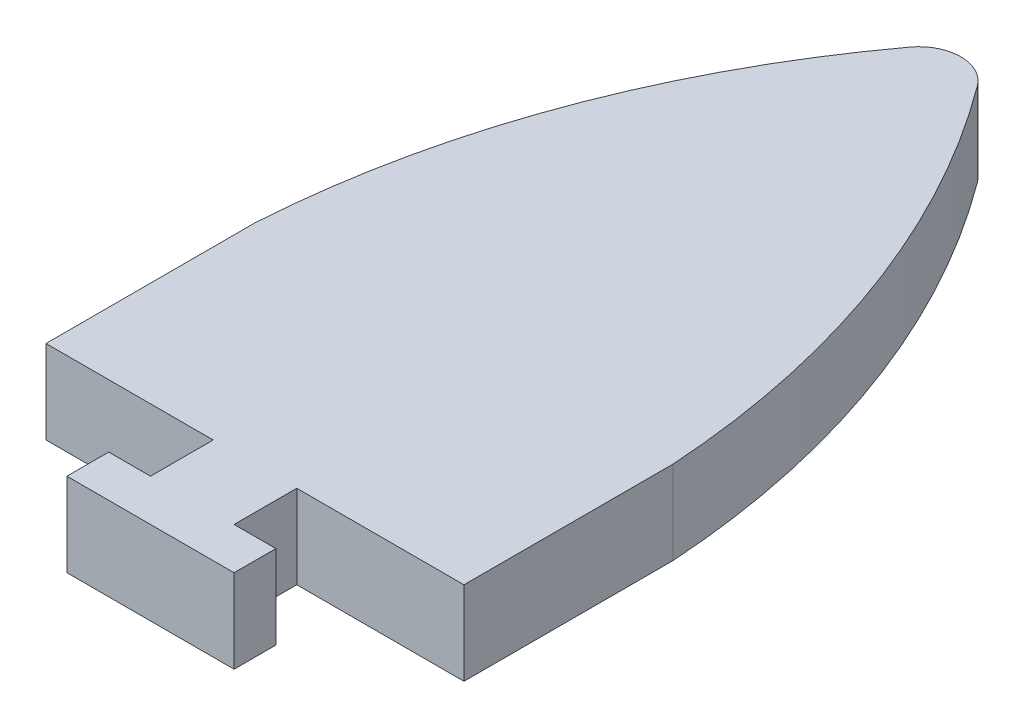
ISO-10303-21;
HEADER;
FILE_DESCRIPTION(('STEP AP214'),'2;1');
FILE_NAME('part.step','',(''),(''),'','','');
FILE_SCHEMA(('AUTOMOTIVE_DESIGN { 1 0 10303 214 1 1 1 1 }'));
ENDSEC;
DATA;
#1=APPLICATION_CONTEXT('core data for automotive mechanical design processes');
#2=APPLICATION_PROTOCOL_DEFINITION('international standard','automotive_design',2000,#1);
#3=PRODUCT_CONTEXT('',#1,'mechanical');
#4=PRODUCT('Part','Part','',(#3));
#5=PRODUCT_RELATED_PRODUCT_CATEGORY('part','',(#4));
#6=PRODUCT_DEFINITION_FORMATION('','',#4);
#7=PRODUCT_DEFINITION_CONTEXT('part definition',#1,'design');
#8=PRODUCT_DEFINITION('design','',#6,#7);
#9=PRODUCT_DEFINITION_SHAPE('','',#8);
#10=(LENGTH_UNIT() NAMED_UNIT(*) SI_UNIT(.MILLI.,.METRE.));
#11=(NAMED_UNIT(*) PLANE_ANGLE_UNIT() SI_UNIT($,.RADIAN.));
#12=(NAMED_UNIT(*) SI_UNIT($,.STERADIAN.) SOLID_ANGLE_UNIT());
#13=UNCERTAINTY_MEASURE_WITH_UNIT(LENGTH_MEASURE(1.E-05),#10,'distance_accuracy_value','');
#14=(GEOMETRIC_REPRESENTATION_CONTEXT(3) GLOBAL_UNCERTAINTY_ASSIGNED_CONTEXT((#13)) GLOBAL_UNIT_ASSIGNED_CONTEXT((#10,
#11,#12)) REPRESENTATION_CONTEXT('',''));
#15=CARTESIAN_POINT('',(0.,0.,0.));
#16=DIRECTION('',(0.,0.,1.));
#17=DIRECTION('',(1.,0.,0.));
#18=AXIS2_PLACEMENT_3D('',#15,#16,#17);
#19=CARTESIAN_POINT('',(0.,4.,-14.2696007662826));
#20=DIRECTION('',(0.,-1.,0.));
#21=DIRECTION('',(0.,0.,-1.));
#22=AXIS2_PLACEMENT_3D('',#19,#20,#21);
#23=CYLINDRICAL_SURFACE('',#22,2.);
#24=CARTESIAN_POINT('',(0.,0.,-14.2696007662826));
#25=DIRECTION('',(0.,1.,0.));
#26=DIRECTION('',(0.,0.,1.));
#27=AXIS2_PLACEMENT_3D('',#24,#25,#26);
#28=CIRCLE('',#27,2.);
#29=CARTESIAN_POINT('',(1.60752586199013,0.,-15.4595001750701));
#30=VERTEX_POINT('',#29);
#31=CARTESIAN_POINT('',(-1.60752586199013,0.,-15.4595001750701));
#32=VERTEX_POINT('',#31);
#33=EDGE_CURVE('E167',#30,#32,#28,.T.);
#34=ORIENTED_EDGE('',*,*,#33,.T.);
#35=DIRECTION('',(0.,-1.,0.));
#36=VECTOR('',#35,1.);
#37=CARTESIAN_POINT('',(-1.60752586199013,4.,-15.4595001750701));
#38=LINE('',#37,#36);
#39=CARTESIAN_POINT('',(-1.60752586199013,4.,-15.4595001750701));
#40=VERTEX_POINT('',#39);
#41=EDGE_CURVE('E11',#40,#32,#38,.T.);
#42=ORIENTED_EDGE('',*,*,#41,.F.);
#43=CARTESIAN_POINT('',(0.,4.,-14.2696007662826));
#44=DIRECTION('',(0.,1.,0.));
#45=DIRECTION('',(0.,0.,1.));
#46=AXIS2_PLACEMENT_3D('',#43,#44,#45);
#47=CIRCLE('',#46,2.);
#48=CARTESIAN_POINT('',(1.60752586199013,4.,-15.4595001750701));
#49=VERTEX_POINT('',#48);
#50=EDGE_CURVE('E193',#49,#40,#47,.T.);
#51=ORIENTED_EDGE('',*,*,#50,.F.);
#52=DIRECTION('',(0.,-1.,0.));
#53=VECTOR('',#52,1.);
#54=CARTESIAN_POINT('',(1.60752586199013,4.,-15.4595001750701));
#55=LINE('',#54,#53);
#56=EDGE_CURVE('E163',#49,#30,#55,.T.);
#57=ORIENTED_EDGE('',*,*,#56,.T.);
#58=EDGE_LOOP('',(#34,#42,#51,#57));
#59=FACE_BOUND('',#58,.T.);
#60=ADVANCED_FACE('F35',(#59),#23,.T.);
#61=CARTESIAN_POINT('',(33.1258675276527,4.,10.2503470110611));
#62=DIRECTION('',(0.,-1.,0.));
#63=DIRECTION('',(0.,0.,-1.));
#64=AXIS2_PLACEMENT_3D('',#61,#62,#63);
#65=CYLINDRICAL_SURFACE('',#64,43.2134800576615);
#66=CARTESIAN_POINT('',(33.1258675276527,0.,10.2503470110611));
#67=DIRECTION('',(0.,1.,0.));
#68=DIRECTION('',(0.,0.,1.));
#69=AXIS2_PLACEMENT_3D('',#66,#67,#68);
#70=CIRCLE('',#69,43.2134800576615);
#71=CARTESIAN_POINT('',(-10.,0.,7.50000000000001));
#72=VERTEX_POINT('',#71);
#73=EDGE_CURVE('E170',#32,#72,#70,.T.);
#74=ORIENTED_EDGE('',*,*,#73,.T.);
#75=DIRECTION('',(0.,-1.,0.));
#76=VECTOR('',#75,1.);
#77=CARTESIAN_POINT('',(-10.,4.,7.50000000000001));
#78=LINE('',#77,#76);
#79=CARTESIAN_POINT('',(-10.,4.,7.50000000000001));
#80=VERTEX_POINT('',#79);
#81=EDGE_CURVE('E43',#80,#72,#78,.T.);
#82=ORIENTED_EDGE('',*,*,#81,.F.);
#83=CARTESIAN_POINT('',(33.1258675276527,4.,10.2503470110611));
#84=DIRECTION('',(0.,1.,0.));
#85=DIRECTION('',(0.,0.,1.));
#86=AXIS2_PLACEMENT_3D('',#83,#84,#85);
#87=CIRCLE('',#86,43.2134800576615);
#88=EDGE_CURVE('E112',#40,#80,#87,.T.);
#89=ORIENTED_EDGE('',*,*,#88,.F.);
#90=ORIENTED_EDGE('',*,*,#41,.T.);
#91=EDGE_LOOP('',(#74,#82,#89,#90));
#92=FACE_BOUND('',#91,.T.);
#93=ADVANCED_FACE('F281',(#92),#65,.T.);
#94=CARTESIAN_POINT('',(-10.,4.,17.5));
#95=DIRECTION('',(1.,0.,0.));
#96=DIRECTION('',(0.,0.,-1.));
#97=AXIS2_PLACEMENT_3D('',#94,#95,#96);
#98=PLANE('',#97);
#99=DIRECTION('',(0.,0.,1.));
#100=VECTOR('',#99,1.);
#101=CARTESIAN_POINT('',(-10.,0.,17.5));
#102=LINE('',#101,#100);
#103=CARTESIAN_POINT('',(-10.,0.,17.5));
#104=VERTEX_POINT('',#103);
#105=EDGE_CURVE('E172',#72,#104,#102,.T.);
#106=ORIENTED_EDGE('',*,*,#105,.T.);
#107=DIRECTION('',(0.,-1.,0.));
#108=VECTOR('',#107,1.);
#109=CARTESIAN_POINT('',(-10.,4.,17.5));
#110=LINE('',#109,#108);
#111=CARTESIAN_POINT('',(-10.,4.,17.5));
#112=VERTEX_POINT('',#111);
#113=EDGE_CURVE('E218',#112,#104,#110,.T.);
#114=ORIENTED_EDGE('',*,*,#113,.F.);
#115=DIRECTION('',(0.,0.,1.));
#116=VECTOR('',#115,1.);
#117=CARTESIAN_POINT('',(-10.,4.,17.5));
#118=LINE('',#117,#116);
#119=EDGE_CURVE('E226',#80,#112,#118,.T.);
#120=ORIENTED_EDGE('',*,*,#119,.F.);
#121=ORIENTED_EDGE('',*,*,#81,.T.);
#122=EDGE_LOOP('',(#106,#114,#120,#121));
#123=FACE_BOUND('',#122,.T.);
#124=ADVANCED_FACE('F224',(#123),#98,.F.);
#125=CARTESIAN_POINT('',(-2.,4.,17.5));
#126=DIRECTION('',(0.,0.,-1.));
#127=DIRECTION('',(-1.,0.,0.));
#128=AXIS2_PLACEMENT_3D('',#125,#126,#127);
#129=PLANE('',#128);
#130=DIRECTION('',(1.,0.,0.));
#131=VECTOR('',#130,1.);
#132=CARTESIAN_POINT('',(-2.,0.,17.5));
#133=LINE('',#132,#131);
#134=CARTESIAN_POINT('',(-2.,0.,17.5));
#135=VERTEX_POINT('',#134);
#136=EDGE_CURVE('E174',#104,#135,#133,.T.);
#137=ORIENTED_EDGE('',*,*,#136,.T.);
#138=DIRECTION('',(0.,-1.,0.));
#139=VECTOR('',#138,1.);
#140=CARTESIAN_POINT('',(-2.,4.,17.5));
#141=LINE('',#140,#139);
#142=CARTESIAN_POINT('',(-2.,4.,17.5));
#143=VERTEX_POINT('',#142);
#144=EDGE_CURVE('E215',#143,#135,#141,.T.);
#145=ORIENTED_EDGE('',*,*,#144,.F.);
#146=DIRECTION('',(1.,0.,0.));
#147=VECTOR('',#146,1.);
#148=CARTESIAN_POINT('',(-2.,4.,17.5));
#149=LINE('',#148,#147);
#150=EDGE_CURVE('E244',#112,#143,#149,.T.);
#151=ORIENTED_EDGE('',*,*,#150,.F.);
#152=ORIENTED_EDGE('',*,*,#113,.T.);
#153=EDGE_LOOP('',(#137,#145,#151,#152));
#154=FACE_BOUND('',#153,.T.);
#155=ADVANCED_FACE('F235',(#154),#129,.F.);
#156=CARTESIAN_POINT('',(-2.,4.,20.5));
#157=DIRECTION('',(1.,0.,0.));
#158=DIRECTION('',(0.,0.,-1.));
#159=AXIS2_PLACEMENT_3D('',#156,#157,#158);
#160=PLANE('',#159);
#161=DIRECTION('',(0.,0.,1.));
#162=VECTOR('',#161,1.);
#163=CARTESIAN_POINT('',(-2.,0.,20.5));
#164=LINE('',#163,#162);
#165=CARTESIAN_POINT('',(-2.,0.,20.5));
#166=VERTEX_POINT('',#165);
#167=EDGE_CURVE('E176',#135,#166,#164,.T.);
#168=ORIENTED_EDGE('',*,*,#167,.T.);
#169=DIRECTION('',(0.,-1.,0.));
#170=VECTOR('',#169,1.);
#171=CARTESIAN_POINT('',(-2.,4.,20.5));
#172=LINE('',#171,#170);
#173=CARTESIAN_POINT('',(-2.,4.,20.5));
#174=VERTEX_POINT('',#173);
#175=EDGE_CURVE('E212',#174,#166,#172,.T.);
#176=ORIENTED_EDGE('',*,*,#175,.F.);
#177=DIRECTION('',(0.,0.,1.));
#178=VECTOR('',#177,1.);
#179=CARTESIAN_POINT('',(-2.,4.,20.5));
#180=LINE('',#179,#178);
#181=EDGE_CURVE('E241',#143,#174,#180,.T.);
#182=ORIENTED_EDGE('',*,*,#181,.F.);
#183=ORIENTED_EDGE('',*,*,#144,.T.);
#184=EDGE_LOOP('',(#168,#176,#182,#183));
#185=FACE_BOUND('',#184,.T.);
#186=ADVANCED_FACE('F239',(#185),#160,.F.);
#187=CARTESIAN_POINT('',(-4.,4.,20.5));
#188=DIRECTION('',(0.,0.,1.));
#189=DIRECTION('',(1.,0.,0.));
#190=AXIS2_PLACEMENT_3D('',#187,#188,#189);
#191=PLANE('',#190);
#192=DIRECTION('',(-1.,0.,0.));
#193=VECTOR('',#192,1.);
#194=CARTESIAN_POINT('',(-4.,0.,20.5));
#195=LINE('',#194,#193);
#196=CARTESIAN_POINT('',(-4.,0.,20.5));
#197=VERTEX_POINT('',#196);
#198=EDGE_CURVE('E178',#166,#197,#195,.T.);
#199=ORIENTED_EDGE('',*,*,#198,.T.);
#200=DIRECTION('',(0.,-1.,0.));
#201=VECTOR('',#200,1.);
#202=CARTESIAN_POINT('',(-4.,4.,20.5));
#203=LINE('',#202,#201);
#204=CARTESIAN_POINT('',(-4.,4.,20.5));
#205=VERTEX_POINT('',#204);
#206=EDGE_CURVE('E209',#205,#197,#203,.T.);
#207=ORIENTED_EDGE('',*,*,#206,.F.);
#208=DIRECTION('',(-1.,0.,0.));
#209=VECTOR('',#208,1.);
#210=CARTESIAN_POINT('',(-4.,4.,20.5));
#211=LINE('',#210,#209);
#212=EDGE_CURVE('E243',#174,#205,#211,.T.);
#213=ORIENTED_EDGE('',*,*,#212,.F.);
#214=ORIENTED_EDGE('',*,*,#175,.T.);
#215=EDGE_LOOP('',(#199,#207,#213,#214));
#216=FACE_BOUND('',#215,.T.);
#217=ADVANCED_FACE('F294',(#216),#191,.F.);
#218=CARTESIAN_POINT('',(-4.,4.,22.5));
#219=DIRECTION('',(1.,0.,0.));
#220=DIRECTION('',(0.,0.,-1.));
#221=AXIS2_PLACEMENT_3D('',#218,#219,#220);
#222=PLANE('',#221);
#223=DIRECTION('',(0.,0.,1.));
#224=VECTOR('',#223,1.);
#225=CARTESIAN_POINT('',(-4.,0.,22.5));
#226=LINE('',#225,#224);
#227=CARTESIAN_POINT('',(-4.,0.,22.5));
#228=VERTEX_POINT('',#227);
#229=EDGE_CURVE('E180',#197,#228,#226,.T.);
#230=ORIENTED_EDGE('',*,*,#229,.T.);
#231=DIRECTION('',(0.,-1.,0.));
#232=VECTOR('',#231,1.);
#233=CARTESIAN_POINT('',(-4.,4.,22.5));
#234=LINE('',#233,#232);
#235=CARTESIAN_POINT('',(-4.,4.,22.5));
#236=VERTEX_POINT('',#235);
#237=EDGE_CURVE('E206',#236,#228,#234,.T.);
#238=ORIENTED_EDGE('',*,*,#237,.F.);
#239=DIRECTION('',(0.,0.,1.));
#240=VECTOR('',#239,1.);
#241=CARTESIAN_POINT('',(-4.,4.,22.5));
#242=LINE('',#241,#240);
#243=EDGE_CURVE('E246',#205,#236,#242,.T.);
#244=ORIENTED_EDGE('',*,*,#243,.F.);
#245=ORIENTED_EDGE('',*,*,#206,.T.);
#246=EDGE_LOOP('',(#230,#238,#244,#245));
#247=FACE_BOUND('',#246,.T.);
#248=ADVANCED_FACE('F297',(#247),#222,.F.);
#249=CARTESIAN_POINT('',(-4.,4.,22.5));
#250=DIRECTION('',(0.,0.,-1.));
#251=DIRECTION('',(-1.,0.,0.));
#252=AXIS2_PLACEMENT_3D('',#249,#250,#251);
#253=PLANE('',#252);
#254=DIRECTION('',(1.,0.,0.));
#255=VECTOR('',#254,1.);
#256=CARTESIAN_POINT('',(-4.,0.,22.5));
#257=LINE('',#256,#255);
#258=CARTESIAN_POINT('',(4.,0.,22.5));
#259=VERTEX_POINT('',#258);
#260=EDGE_CURVE('E182',#228,#259,#257,.T.);
#261=ORIENTED_EDGE('',*,*,#260,.T.);
#262=DIRECTION('',(0.,-1.,0.));
#263=VECTOR('',#262,1.);
#264=CARTESIAN_POINT('',(4.,4.,22.5));
#265=LINE('',#264,#263);
#266=CARTESIAN_POINT('',(4.,4.,22.5));
#267=VERTEX_POINT('',#266);
#268=EDGE_CURVE('E203',#267,#259,#265,.T.);
#269=ORIENTED_EDGE('',*,*,#268,.F.);
#270=DIRECTION('',(1.,0.,0.));
#271=VECTOR('',#270,1.);
#272=CARTESIAN_POINT('',(-4.,4.,22.5));
#273=LINE('',#272,#271);
#274=EDGE_CURVE('E252',#236,#267,#273,.T.);
#275=ORIENTED_EDGE('',*,*,#274,.F.);
#276=ORIENTED_EDGE('',*,*,#237,.T.);
#277=EDGE_LOOP('',(#261,#269,#275,#276));
#278=FACE_BOUND('',#277,.T.);
#279=ADVANCED_FACE('F301',(#278),#253,.F.);
#280=CARTESIAN_POINT('',(4.,4.,22.5));
#281=DIRECTION('',(-1.,0.,0.));
#282=DIRECTION('',(0.,0.,1.));
#283=AXIS2_PLACEMENT_3D('',#280,#281,#282);
#284=PLANE('',#283);
#285=DIRECTION('',(0.,0.,-1.));
#286=VECTOR('',#285,1.);
#287=CARTESIAN_POINT('',(4.,0.,22.5));
#288=LINE('',#287,#286);
#289=CARTESIAN_POINT('',(4.,0.,20.5));
#290=VERTEX_POINT('',#289);
#291=EDGE_CURVE('E184',#259,#290,#288,.T.);
#292=ORIENTED_EDGE('',*,*,#291,.T.);
#293=DIRECTION('',(0.,-1.,0.));
#294=VECTOR('',#293,1.);
#295=CARTESIAN_POINT('',(4.,4.,20.5));
#296=LINE('',#295,#294);
#297=CARTESIAN_POINT('',(4.,4.,20.5));
#298=VERTEX_POINT('',#297);
#299=EDGE_CURVE('E200',#298,#290,#296,.T.);
#300=ORIENTED_EDGE('',*,*,#299,.F.);
#301=DIRECTION('',(0.,0.,-1.));
#302=VECTOR('',#301,1.);
#303=CARTESIAN_POINT('',(4.,4.,22.5));
#304=LINE('',#303,#302);
#305=EDGE_CURVE('E254',#267,#298,#304,.T.);
#306=ORIENTED_EDGE('',*,*,#305,.F.);
#307=ORIENTED_EDGE('',*,*,#268,.T.);
#308=EDGE_LOOP('',(#292,#300,#306,#307));
#309=FACE_BOUND('',#308,.T.);
#310=ADVANCED_FACE('F305',(#309),#284,.F.);
#311=CARTESIAN_POINT('',(4.,4.,20.5));
#312=DIRECTION('',(0.,0.,1.));
#313=DIRECTION('',(1.,0.,0.));
#314=AXIS2_PLACEMENT_3D('',#311,#312,#313);
#315=PLANE('',#314);
#316=DIRECTION('',(-1.,0.,0.));
#317=VECTOR('',#316,1.);
#318=CARTESIAN_POINT('',(4.,0.,20.5));
#319=LINE('',#318,#317);
#320=CARTESIAN_POINT('',(2.,0.,20.5));
#321=VERTEX_POINT('',#320);
#322=EDGE_CURVE('E186',#290,#321,#319,.T.);
#323=ORIENTED_EDGE('',*,*,#322,.T.);
#324=DIRECTION('',(0.,-1.,0.));
#325=VECTOR('',#324,1.);
#326=CARTESIAN_POINT('',(2.,4.,20.5));
#327=LINE('',#326,#325);
#328=CARTESIAN_POINT('',(2.,4.,20.5));
#329=VERTEX_POINT('',#328);
#330=EDGE_CURVE('E197',#329,#321,#327,.T.);
#331=ORIENTED_EDGE('',*,*,#330,.F.);
#332=DIRECTION('',(-1.,0.,0.));
#333=VECTOR('',#332,1.);
#334=CARTESIAN_POINT('',(4.,4.,20.5));
#335=LINE('',#334,#333);
#336=EDGE_CURVE('E256',#298,#329,#335,.T.);
#337=ORIENTED_EDGE('',*,*,#336,.F.);
#338=ORIENTED_EDGE('',*,*,#299,.T.);
#339=EDGE_LOOP('',(#323,#331,#337,#338));
#340=FACE_BOUND('',#339,.T.);
#341=ADVANCED_FACE('F262',(#340),#315,.F.);
#342=CARTESIAN_POINT('',(2.,4.,20.5));
#343=DIRECTION('',(-1.,0.,0.));
#344=DIRECTION('',(0.,0.,1.));
#345=AXIS2_PLACEMENT_3D('',#342,#343,#344);
#346=PLANE('',#345);
#347=DIRECTION('',(0.,0.,-1.));
#348=VECTOR('',#347,1.);
#349=CARTESIAN_POINT('',(2.,0.,20.5));
#350=LINE('',#349,#348);
#351=CARTESIAN_POINT('',(2.,0.,17.5));
#352=VERTEX_POINT('',#351);
#353=EDGE_CURVE('E188',#321,#352,#350,.T.);
#354=ORIENTED_EDGE('',*,*,#353,.T.);
#355=DIRECTION('',(0.,-1.,0.));
#356=VECTOR('',#355,1.);
#357=CARTESIAN_POINT('',(2.,4.,17.5));
#358=LINE('',#357,#356);
#359=CARTESIAN_POINT('',(2.,4.,17.5));
#360=VERTEX_POINT('',#359);
#361=EDGE_CURVE('E158',#360,#352,#358,.T.);
#362=ORIENTED_EDGE('',*,*,#361,.F.);
#363=DIRECTION('',(0.,0.,-1.));
#364=VECTOR('',#363,1.);
#365=CARTESIAN_POINT('',(2.,4.,20.5));
#366=LINE('',#365,#364);
#367=EDGE_CURVE('E149',#329,#360,#366,.T.);
#368=ORIENTED_EDGE('',*,*,#367,.F.);
#369=ORIENTED_EDGE('',*,*,#330,.T.);
#370=EDGE_LOOP('',(#354,#362,#368,#369));
#371=FACE_BOUND('',#370,.T.);
#372=ADVANCED_FACE('F266',(#371),#346,.F.);
#373=CARTESIAN_POINT('',(10.,4.,17.5));
#374=DIRECTION('',(0.,0.,-1.));
#375=DIRECTION('',(-1.,0.,0.));
#376=AXIS2_PLACEMENT_3D('',#373,#374,#375);
#377=PLANE('',#376);
#378=DIRECTION('',(1.,0.,0.));
#379=VECTOR('',#378,1.);
#380=CARTESIAN_POINT('',(10.,0.,17.5));
#381=LINE('',#380,#379);
#382=CARTESIAN_POINT('',(10.,0.,17.5));
#383=VERTEX_POINT('',#382);
#384=EDGE_CURVE('E157',#352,#383,#381,.T.);
#385=ORIENTED_EDGE('',*,*,#384,.T.);
#386=DIRECTION('',(0.,-1.,0.));
#387=VECTOR('',#386,1.);
#388=CARTESIAN_POINT('',(10.,4.,17.5));
#389=LINE('',#388,#387);
#390=CARTESIAN_POINT('',(10.,4.,17.5));
#391=VERTEX_POINT('',#390);
#392=EDGE_CURVE('E154',#391,#383,#389,.T.);
#393=ORIENTED_EDGE('',*,*,#392,.F.);
#394=DIRECTION('',(1.,0.,0.));
#395=VECTOR('',#394,1.);
#396=CARTESIAN_POINT('',(10.,4.,17.5));
#397=LINE('',#396,#395);
#398=EDGE_CURVE('E143',#360,#391,#397,.T.);
#399=ORIENTED_EDGE('',*,*,#398,.F.);
#400=ORIENTED_EDGE('',*,*,#361,.T.);
#401=EDGE_LOOP('',(#385,#393,#399,#400));
#402=FACE_BOUND('',#401,.T.);
#403=ADVANCED_FACE('F155',(#402),#377,.F.);
#404=CARTESIAN_POINT('',(10.,4.,17.5));
#405=DIRECTION('',(-1.,0.,0.));
#406=DIRECTION('',(0.,0.,1.));
#407=AXIS2_PLACEMENT_3D('',#404,#405,#406);
#408=PLANE('',#407);
#409=DIRECTION('',(0.,0.,-1.));
#410=VECTOR('',#409,1.);
#411=CARTESIAN_POINT('',(10.,0.,17.5));
#412=LINE('',#411,#410);
#413=CARTESIAN_POINT('',(9.99999999999999,0.,7.5));
#414=VERTEX_POINT('',#413);
#415=EDGE_CURVE('E98',#383,#414,#412,.T.);
#416=ORIENTED_EDGE('',*,*,#415,.T.);
#417=DIRECTION('',(0.,-1.,0.));
#418=VECTOR('',#417,1.);
#419=CARTESIAN_POINT('',(9.99999999999999,4.,7.5));
#420=LINE('',#419,#418);
#421=CARTESIAN_POINT('',(9.99999999999999,4.,7.5));
#422=VERTEX_POINT('',#421);
#423=EDGE_CURVE('E159',#422,#414,#420,.T.);
#424=ORIENTED_EDGE('',*,*,#423,.F.);
#425=DIRECTION('',(0.,0.,-1.));
#426=VECTOR('',#425,1.);
#427=CARTESIAN_POINT('',(10.,4.,17.5));
#428=LINE('',#427,#426);
#429=EDGE_CURVE('E147',#391,#422,#428,.T.);
#430=ORIENTED_EDGE('',*,*,#429,.F.);
#431=ORIENTED_EDGE('',*,*,#392,.T.);
#432=EDGE_LOOP('',(#416,#424,#430,#431));
#433=FACE_BOUND('',#432,.T.);
#434=ADVANCED_FACE('F161',(#433),#408,.F.);
#435=CARTESIAN_POINT('',(-33.1258675276527,4.,10.2503470110611));
#436=DIRECTION('',(0.,-1.,0.));
#437=DIRECTION('',(0.,0.,-1.));
#438=AXIS2_PLACEMENT_3D('',#435,#436,#437);
#439=CYLINDRICAL_SURFACE('',#438,43.2134800576615);
#440=CARTESIAN_POINT('',(-33.1258675276527,0.,10.2503470110611));
#441=DIRECTION('',(0.,1.,0.));
#442=DIRECTION('',(0.,0.,-1.));
#443=AXIS2_PLACEMENT_3D('',#440,#441,#442);
#444=CIRCLE('',#443,43.2134800576615);
#445=EDGE_CURVE('E104',#414,#30,#444,.T.);
#446=ORIENTED_EDGE('',*,*,#445,.T.);
#447=ORIENTED_EDGE('',*,*,#56,.F.);
#448=CARTESIAN_POINT('',(-33.1258675276527,4.,10.2503470110611));
#449=DIRECTION('',(0.,1.,0.));
#450=DIRECTION('',(0.,0.,-1.));
#451=AXIS2_PLACEMENT_3D('',#448,#449,#450);
#452=CIRCLE('',#451,43.2134800576615);
#453=EDGE_CURVE('E51',#422,#49,#452,.T.);
#454=ORIENTED_EDGE('',*,*,#453,.F.);
#455=ORIENTED_EDGE('',*,*,#423,.T.);
#456=EDGE_LOOP('',(#446,#447,#454,#455));
#457=FACE_BOUND('',#456,.T.);
#458=ADVANCED_FACE('F270',(#457),#439,.T.);
#459=CARTESIAN_POINT('',(0.,4.,-14.2696007662826));
#460=DIRECTION('',(0.,1.,0.));
#461=DIRECTION('',(0.,0.,1.));
#462=AXIS2_PLACEMENT_3D('',#459,#460,#461);
#463=PLANE('',#462);
#464=ORIENTED_EDGE('',*,*,#50,.T.);
#465=ORIENTED_EDGE('',*,*,#88,.T.);
#466=ORIENTED_EDGE('',*,*,#119,.T.);
#467=ORIENTED_EDGE('',*,*,#150,.T.);
#468=ORIENTED_EDGE('',*,*,#181,.T.);
#469=ORIENTED_EDGE('',*,*,#212,.T.);
#470=ORIENTED_EDGE('',*,*,#243,.T.);
#471=ORIENTED_EDGE('',*,*,#274,.T.);
#472=ORIENTED_EDGE('',*,*,#305,.T.);
#473=ORIENTED_EDGE('',*,*,#336,.T.);
#474=ORIENTED_EDGE('',*,*,#367,.T.);
#475=ORIENTED_EDGE('',*,*,#398,.T.);
#476=ORIENTED_EDGE('',*,*,#429,.T.);
#477=ORIENTED_EDGE('',*,*,#453,.T.);
#478=EDGE_LOOP('',(#464,#465,#466,#467,#468,#469,#470,#471,#472,#473,#474,#475,#476,#477));
#479=FACE_BOUND('',#478,.T.);
#480=ADVANCED_FACE('F145',(#479),#463,.T.);
#481=CARTESIAN_POINT('',(0.,0.,-14.2696007662826));
#482=DIRECTION('',(0.,1.,0.));
#483=DIRECTION('',(0.,0.,1.));
#484=AXIS2_PLACEMENT_3D('',#481,#482,#483);
#485=PLANE('',#484);
#486=ORIENTED_EDGE('',*,*,#33,.F.);
#487=ORIENTED_EDGE('',*,*,#445,.F.);
#488=ORIENTED_EDGE('',*,*,#415,.F.);
#489=ORIENTED_EDGE('',*,*,#384,.F.);
#490=ORIENTED_EDGE('',*,*,#353,.F.);
#491=ORIENTED_EDGE('',*,*,#322,.F.);
#492=ORIENTED_EDGE('',*,*,#291,.F.);
#493=ORIENTED_EDGE('',*,*,#260,.F.);
#494=ORIENTED_EDGE('',*,*,#229,.F.);
#495=ORIENTED_EDGE('',*,*,#198,.F.);
#496=ORIENTED_EDGE('',*,*,#167,.F.);
#497=ORIENTED_EDGE('',*,*,#136,.F.);
#498=ORIENTED_EDGE('',*,*,#105,.F.);
#499=ORIENTED_EDGE('',*,*,#73,.F.);
#500=EDGE_LOOP('',(#486,#487,#488,#489,#490,#491,#492,#493,#494,#495,#496,#497,#498,#499));
#501=FACE_BOUND('',#500,.T.);
#502=ADVANCED_FACE('F230',(#501),#485,.F.);
#503=CLOSED_SHELL('',(#60,#93,#124,#155,#186,#217,#248,#279,#310,#341,#372,#403,#434,#458,#480,#502));
#504=MANIFOLD_SOLID_BREP('B2',#503);
#505=ADVANCED_BREP_SHAPE_REPRESENTATION('',(#18,#504),#14);
#506=SHAPE_DEFINITION_REPRESENTATION(#9,#505);
ENDSEC;
END-ISO-10303-21;
